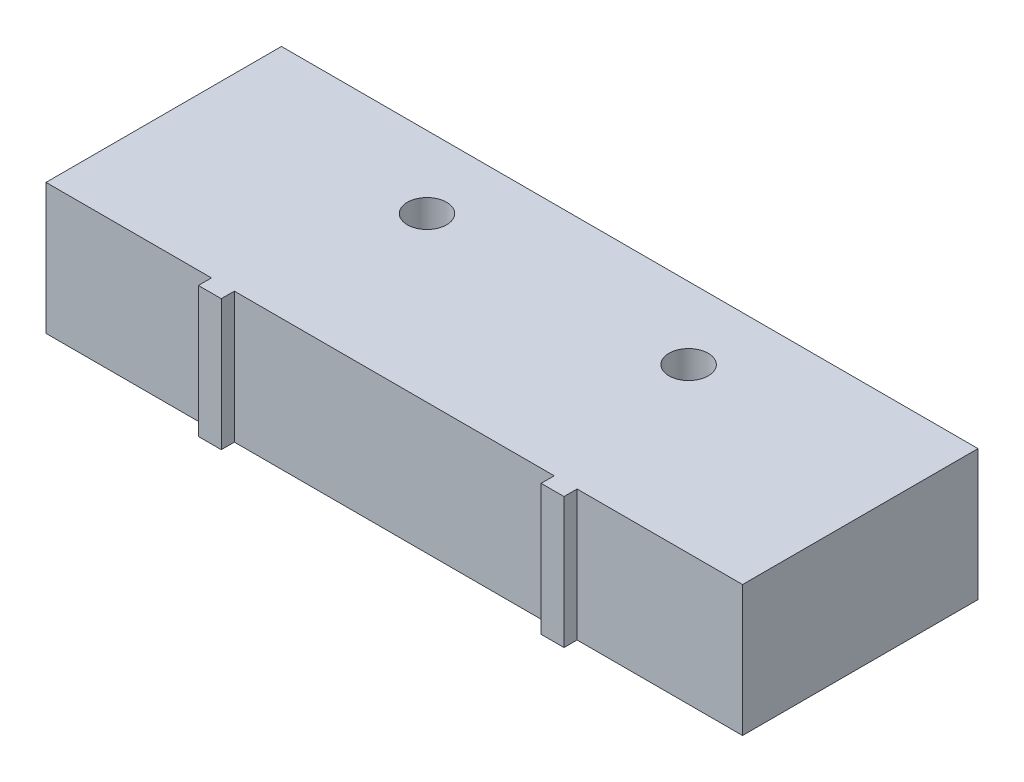
ISO-10303-21;
HEADER;
FILE_DESCRIPTION(('STEP AP214'),'2;1');
FILE_NAME('part.step','',(''),(''),'','','');
FILE_SCHEMA(('AUTOMOTIVE_DESIGN { 1 0 10303 214 1 1 1 1 }'));
ENDSEC;
DATA;
#1=APPLICATION_CONTEXT('core data for automotive mechanical design processes');
#2=APPLICATION_PROTOCOL_DEFINITION('international standard','automotive_design',2000,#1);
#3=PRODUCT_CONTEXT('',#1,'mechanical');
#4=PRODUCT('Part','Part','',(#3));
#5=PRODUCT_RELATED_PRODUCT_CATEGORY('part','',(#4));
#6=PRODUCT_DEFINITION_FORMATION('','',#4);
#7=PRODUCT_DEFINITION_CONTEXT('part definition',#1,'design');
#8=PRODUCT_DEFINITION('design','',#6,#7);
#9=PRODUCT_DEFINITION_SHAPE('','',#8);
#10=(LENGTH_UNIT() NAMED_UNIT(*) SI_UNIT(.MILLI.,.METRE.));
#11=(NAMED_UNIT(*) PLANE_ANGLE_UNIT() SI_UNIT($,.RADIAN.));
#12=(NAMED_UNIT(*) SI_UNIT($,.STERADIAN.) SOLID_ANGLE_UNIT());
#13=UNCERTAINTY_MEASURE_WITH_UNIT(LENGTH_MEASURE(1.E-05),#10,'distance_accuracy_value','');
#14=(GEOMETRIC_REPRESENTATION_CONTEXT(3) GLOBAL_UNCERTAINTY_ASSIGNED_CONTEXT((#13)) GLOBAL_UNIT_ASSIGNED_CONTEXT((#10,
#11,#12)) REPRESENTATION_CONTEXT('',''));
#15=CARTESIAN_POINT('',(0.,0.,0.));
#16=DIRECTION('',(0.,0.,1.));
#17=DIRECTION('',(1.,0.,0.));
#18=AXIS2_PLACEMENT_3D('',#15,#16,#17);
#19=CARTESIAN_POINT('',(0.,20.,0.));
#20=DIRECTION('',(0.,-1.,0.));
#21=DIRECTION('',(0.,0.,-1.));
#22=AXIS2_PLACEMENT_3D('',#19,#20,#21);
#23=PLANE('',#22);
#24=DIRECTION('',(0.,0.,1.));
#25=VECTOR('',#24,1.);
#26=CARTESIAN_POINT('',(0.,20.,0.));
#27=LINE('',#26,#25);
#28=CARTESIAN_POINT('',(0.,20.,-36.));
#29=VERTEX_POINT('',#28);
#30=CARTESIAN_POINT('',(0.,20.,0.));
#31=VERTEX_POINT('',#30);
#32=EDGE_CURVE('E206',#29,#31,#27,.T.);
#33=ORIENTED_EDGE('',*,*,#32,.T.);
#34=DIRECTION('',(1.,0.,0.));
#35=VECTOR('',#34,1.);
#36=CARTESIAN_POINT('',(0.,20.,0.));
#37=LINE('',#36,#35);
#38=CARTESIAN_POINT('',(25.3,20.,0.));
#39=VERTEX_POINT('',#38);
#40=EDGE_CURVE('E118',#31,#39,#37,.T.);
#41=ORIENTED_EDGE('',*,*,#40,.T.);
#42=DIRECTION('',(0.,0.,1.));
#43=VECTOR('',#42,1.);
#44=CARTESIAN_POINT('',(25.3,20.,0.));
#45=LINE('',#44,#43);
#46=CARTESIAN_POINT('',(25.3,20.,2.));
#47=VERTEX_POINT('',#46);
#48=EDGE_CURVE('E243',#39,#47,#45,.T.);
#49=ORIENTED_EDGE('',*,*,#48,.T.);
#50=DIRECTION('',(1.,0.,0.));
#51=VECTOR('',#50,1.);
#52=CARTESIAN_POINT('',(25.3,20.,2.));
#53=LINE('',#52,#51);
#54=CARTESIAN_POINT('',(28.8,20.,2.));
#55=VERTEX_POINT('',#54);
#56=EDGE_CURVE('E263',#47,#55,#53,.T.);
#57=ORIENTED_EDGE('',*,*,#56,.T.);
#58=DIRECTION('',(0.,0.,-1.));
#59=VECTOR('',#58,1.);
#60=CARTESIAN_POINT('',(28.8,20.,2.));
#61=LINE('',#60,#59);
#62=CARTESIAN_POINT('',(28.8,20.,0.));
#63=VERTEX_POINT('',#62);
#64=EDGE_CURVE('E259',#55,#63,#61,.T.);
#65=ORIENTED_EDGE('',*,*,#64,.T.);
#66=DIRECTION('',(1.,0.,0.));
#67=VECTOR('',#66,1.);
#68=CARTESIAN_POINT('',(28.8,20.,0.));
#69=LINE('',#68,#67);
#70=CARTESIAN_POINT('',(77.7,20.,0.));
#71=VERTEX_POINT('',#70);
#72=EDGE_CURVE('E262',#63,#71,#69,.T.);
#73=ORIENTED_EDGE('',*,*,#72,.T.);
#74=DIRECTION('',(0.,0.,1.));
#75=VECTOR('',#74,1.);
#76=CARTESIAN_POINT('',(77.7,20.,1.99999999999999));
#77=LINE('',#76,#75);
#78=CARTESIAN_POINT('',(77.7,20.,1.99999999999999));
#79=VERTEX_POINT('',#78);
#80=EDGE_CURVE('E267',#71,#79,#77,.T.);
#81=ORIENTED_EDGE('',*,*,#80,.T.);
#82=DIRECTION('',(1.,0.,0.));
#83=VECTOR('',#82,1.);
#84=CARTESIAN_POINT('',(81.2,20.,1.99999999999999));
#85=LINE('',#84,#83);
#86=CARTESIAN_POINT('',(81.2,20.,1.99999999999999));
#87=VERTEX_POINT('',#86);
#88=EDGE_CURVE('E274',#79,#87,#85,.T.);
#89=ORIENTED_EDGE('',*,*,#88,.T.);
#90=DIRECTION('',(0.,0.,-1.));
#91=VECTOR('',#90,1.);
#92=CARTESIAN_POINT('',(81.2,20.,0.));
#93=LINE('',#92,#91);
#94=CARTESIAN_POINT('',(81.2,20.,0.));
#95=VERTEX_POINT('',#94);
#96=EDGE_CURVE('E149',#87,#95,#93,.T.);
#97=ORIENTED_EDGE('',*,*,#96,.T.);
#98=DIRECTION('',(1.,0.,0.));
#99=VECTOR('',#98,1.);
#100=CARTESIAN_POINT('',(81.2,20.,0.));
#101=LINE('',#100,#99);
#102=CARTESIAN_POINT('',(106.5,20.,0.));
#103=VERTEX_POINT('',#102);
#104=EDGE_CURVE('E143',#95,#103,#101,.T.);
#105=ORIENTED_EDGE('',*,*,#104,.T.);
#106=DIRECTION('',(0.,0.,-1.));
#107=VECTOR('',#106,1.);
#108=CARTESIAN_POINT('',(106.5,20.,0.));
#109=LINE('',#108,#107);
#110=CARTESIAN_POINT('',(106.5,20.,-36.));
#111=VERTEX_POINT('',#110);
#112=EDGE_CURVE('E147',#103,#111,#109,.T.);
#113=ORIENTED_EDGE('',*,*,#112,.T.);
#114=DIRECTION('',(-1.,0.,0.));
#115=VECTOR('',#114,1.);
#116=CARTESIAN_POINT('',(0.,20.,-36.));
#117=LINE('',#116,#115);
#118=EDGE_CURVE('E63',#111,#29,#117,.T.);
#119=ORIENTED_EDGE('',*,*,#118,.T.);
#120=EDGE_LOOP('',(#33,#41,#49,#57,#65,#73,#81,#89,#97,#105,#113,#119));
#121=FACE_BOUND('',#120,.T.);
#122=CARTESIAN_POINT('',(33.25,20.,-25.));
#123=DIRECTION('',(0.,1.,0.));
#124=DIRECTION('',(0.,0.,1.));
#125=AXIS2_PLACEMENT_3D('',#122,#123,#124);
#126=CIRCLE('',#125,3.);
#127=CARTESIAN_POINT('',(33.25,20.,-22.));
#128=VERTEX_POINT('',#127);
#129=EDGE_CURVE('E176',#128,#128,#126,.T.);
#130=ORIENTED_EDGE('',*,*,#129,.F.);
#131=EDGE_LOOP('',(#130));
#132=FACE_BOUND('',#131,.T.);
#133=CARTESIAN_POINT('',(73.25,20.,-25.));
#134=DIRECTION('',(0.,1.,0.));
#135=DIRECTION('',(0.,0.,-1.));
#136=AXIS2_PLACEMENT_3D('',#133,#134,#135);
#137=CIRCLE('',#136,3.00000000000001);
#138=CARTESIAN_POINT('',(73.25,20.,-28.));
#139=VERTEX_POINT('',#138);
#140=EDGE_CURVE('E317',#139,#139,#137,.T.);
#141=ORIENTED_EDGE('',*,*,#140,.F.);
#142=EDGE_LOOP('',(#141));
#143=FACE_BOUND('',#142,.T.);
#144=ADVANCED_FACE('F45',(#121,#132,#143),#23,.F.);
#145=CARTESIAN_POINT('',(0.,0.,0.));
#146=DIRECTION('',(0.,-1.,0.));
#147=DIRECTION('',(0.,0.,-1.));
#148=AXIS2_PLACEMENT_3D('',#145,#146,#147);
#149=PLANE('',#148);
#150=CARTESIAN_POINT('',(33.25,0.,-25.));
#151=DIRECTION('',(0.,1.,0.));
#152=DIRECTION('',(0.,0.,1.));
#153=AXIS2_PLACEMENT_3D('',#150,#151,#152);
#154=CIRCLE('',#153,3.);
#155=CARTESIAN_POINT('',(33.25,0.,-22.));
#156=VERTEX_POINT('',#155);
#157=EDGE_CURVE('E324',#156,#156,#154,.T.);
#158=ORIENTED_EDGE('',*,*,#157,.T.);
#159=EDGE_LOOP('',(#158));
#160=FACE_BOUND('',#159,.T.);
#161=DIRECTION('',(0.,0.,1.));
#162=VECTOR('',#161,1.);
#163=CARTESIAN_POINT('',(0.,0.,0.));
#164=LINE('',#163,#162);
#165=CARTESIAN_POINT('',(0.,0.,-36.));
#166=VERTEX_POINT('',#165);
#167=CARTESIAN_POINT('',(0.,0.,0.));
#168=VERTEX_POINT('',#167);
#169=EDGE_CURVE('E171',#166,#168,#164,.T.);
#170=ORIENTED_EDGE('',*,*,#169,.F.);
#171=DIRECTION('',(-1.,0.,0.));
#172=VECTOR('',#171,1.);
#173=CARTESIAN_POINT('',(0.,0.,-36.));
#174=LINE('',#173,#172);
#175=CARTESIAN_POINT('',(106.5,0.,-36.));
#176=VERTEX_POINT('',#175);
#177=EDGE_CURVE('E110',#176,#166,#174,.T.);
#178=ORIENTED_EDGE('',*,*,#177,.F.);
#179=DIRECTION('',(0.,0.,-1.));
#180=VECTOR('',#179,1.);
#181=CARTESIAN_POINT('',(106.5,0.,0.));
#182=LINE('',#181,#180);
#183=CARTESIAN_POINT('',(106.5,0.,0.));
#184=VERTEX_POINT('',#183);
#185=EDGE_CURVE('E104',#184,#176,#182,.T.);
#186=ORIENTED_EDGE('',*,*,#185,.F.);
#187=DIRECTION('',(1.,0.,0.));
#188=VECTOR('',#187,1.);
#189=CARTESIAN_POINT('',(81.2,0.,0.));
#190=LINE('',#189,#188);
#191=CARTESIAN_POINT('',(81.2,0.,0.));
#192=VERTEX_POINT('',#191);
#193=EDGE_CURVE('E158',#192,#184,#190,.T.);
#194=ORIENTED_EDGE('',*,*,#193,.F.);
#195=DIRECTION('',(0.,0.,-1.));
#196=VECTOR('',#195,1.);
#197=CARTESIAN_POINT('',(81.2,0.,0.));
#198=LINE('',#197,#196);
#199=CARTESIAN_POINT('',(81.2,0.,1.99999999999999));
#200=VERTEX_POINT('',#199);
#201=EDGE_CURVE('E197',#200,#192,#198,.T.);
#202=ORIENTED_EDGE('',*,*,#201,.F.);
#203=DIRECTION('',(1.,0.,0.));
#204=VECTOR('',#203,1.);
#205=CARTESIAN_POINT('',(81.2,0.,1.99999999999999));
#206=LINE('',#205,#204);
#207=CARTESIAN_POINT('',(77.7,0.,1.99999999999999));
#208=VERTEX_POINT('',#207);
#209=EDGE_CURVE('E194',#208,#200,#206,.T.);
#210=ORIENTED_EDGE('',*,*,#209,.F.);
#211=DIRECTION('',(0.,0.,1.));
#212=VECTOR('',#211,1.);
#213=CARTESIAN_POINT('',(77.7,0.,1.99999999999999));
#214=LINE('',#213,#212);
#215=CARTESIAN_POINT('',(77.7,0.,0.));
#216=VERTEX_POINT('',#215);
#217=EDGE_CURVE('E191',#216,#208,#214,.T.);
#218=ORIENTED_EDGE('',*,*,#217,.F.);
#219=DIRECTION('',(1.,0.,0.));
#220=VECTOR('',#219,1.);
#221=CARTESIAN_POINT('',(28.8,0.,0.));
#222=LINE('',#221,#220);
#223=CARTESIAN_POINT('',(28.8,0.,0.));
#224=VERTEX_POINT('',#223);
#225=EDGE_CURVE('E188',#224,#216,#222,.T.);
#226=ORIENTED_EDGE('',*,*,#225,.F.);
#227=DIRECTION('',(0.,0.,-1.));
#228=VECTOR('',#227,1.);
#229=CARTESIAN_POINT('',(28.8,0.,2.));
#230=LINE('',#229,#228);
#231=CARTESIAN_POINT('',(28.8,0.,2.));
#232=VERTEX_POINT('',#231);
#233=EDGE_CURVE('E185',#232,#224,#230,.T.);
#234=ORIENTED_EDGE('',*,*,#233,.F.);
#235=DIRECTION('',(1.,0.,0.));
#236=VECTOR('',#235,1.);
#237=CARTESIAN_POINT('',(25.3,0.,2.));
#238=LINE('',#237,#236);
#239=CARTESIAN_POINT('',(25.3,0.,2.));
#240=VERTEX_POINT('',#239);
#241=EDGE_CURVE('E182',#240,#232,#238,.T.);
#242=ORIENTED_EDGE('',*,*,#241,.F.);
#243=DIRECTION('',(0.,0.,1.));
#244=VECTOR('',#243,1.);
#245=CARTESIAN_POINT('',(25.3,0.,0.));
#246=LINE('',#245,#244);
#247=CARTESIAN_POINT('',(25.3,0.,0.));
#248=VERTEX_POINT('',#247);
#249=EDGE_CURVE('E179',#248,#240,#246,.T.);
#250=ORIENTED_EDGE('',*,*,#249,.F.);
#251=DIRECTION('',(1.,0.,0.));
#252=VECTOR('',#251,1.);
#253=CARTESIAN_POINT('',(0.,0.,0.));
#254=LINE('',#253,#252);
#255=EDGE_CURVE('E175',#168,#248,#254,.T.);
#256=ORIENTED_EDGE('',*,*,#255,.F.);
#257=EDGE_LOOP('',(#170,#178,#186,#194,#202,#210,#218,#226,#234,#242,#250,#256));
#258=FACE_BOUND('',#257,.T.);
#259=CARTESIAN_POINT('',(73.25,0.,-25.));
#260=DIRECTION('',(0.,1.,0.));
#261=DIRECTION('',(0.,0.,-1.));
#262=AXIS2_PLACEMENT_3D('',#259,#260,#261);
#263=CIRCLE('',#262,3.00000000000001);
#264=CARTESIAN_POINT('',(73.25,0.,-28.));
#265=VERTEX_POINT('',#264);
#266=EDGE_CURVE('E320',#265,#265,#263,.T.);
#267=ORIENTED_EDGE('',*,*,#266,.T.);
#268=EDGE_LOOP('',(#267));
#269=FACE_BOUND('',#268,.T.);
#270=ADVANCED_FACE('F247',(#160,#258,#269),#149,.T.);
#271=CARTESIAN_POINT('',(0.,20.,0.));
#272=DIRECTION('',(1.,0.,0.));
#273=DIRECTION('',(0.,0.,-1.));
#274=AXIS2_PLACEMENT_3D('',#271,#272,#273);
#275=PLANE('',#274);
#276=ORIENTED_EDGE('',*,*,#169,.T.);
#277=DIRECTION('',(0.,-1.,0.));
#278=VECTOR('',#277,1.);
#279=CARTESIAN_POINT('',(0.,20.,0.));
#280=LINE('',#279,#278);
#281=EDGE_CURVE('E11',#31,#168,#280,.T.);
#282=ORIENTED_EDGE('',*,*,#281,.F.);
#283=ORIENTED_EDGE('',*,*,#32,.F.);
#284=DIRECTION('',(0.,-1.,0.));
#285=VECTOR('',#284,1.);
#286=CARTESIAN_POINT('',(0.,20.,-36.));
#287=LINE('',#286,#285);
#288=EDGE_CURVE('E167',#29,#166,#287,.T.);
#289=ORIENTED_EDGE('',*,*,#288,.T.);
#290=EDGE_LOOP('',(#276,#282,#283,#289));
#291=FACE_BOUND('',#290,.T.);
#292=ADVANCED_FACE('F47',(#291),#275,.F.);
#293=CARTESIAN_POINT('',(0.,20.,0.));
#294=DIRECTION('',(0.,0.,-1.));
#295=DIRECTION('',(-1.,0.,0.));
#296=AXIS2_PLACEMENT_3D('',#293,#294,#295);
#297=PLANE('',#296);
#298=ORIENTED_EDGE('',*,*,#255,.T.);
#299=DIRECTION('',(0.,-1.,0.));
#300=VECTOR('',#299,1.);
#301=CARTESIAN_POINT('',(25.3,20.,0.));
#302=LINE('',#301,#300);
#303=EDGE_CURVE('E55',#39,#248,#302,.T.);
#304=ORIENTED_EDGE('',*,*,#303,.F.);
#305=ORIENTED_EDGE('',*,*,#40,.F.);
#306=ORIENTED_EDGE('',*,*,#281,.T.);
#307=EDGE_LOOP('',(#298,#304,#305,#306));
#308=FACE_BOUND('',#307,.T.);
#309=ADVANCED_FACE('F426',(#308),#297,.F.);
#310=CARTESIAN_POINT('',(25.3,20.,0.));
#311=DIRECTION('',(1.,0.,0.));
#312=DIRECTION('',(0.,0.,-1.));
#313=AXIS2_PLACEMENT_3D('',#310,#311,#312);
#314=PLANE('',#313);
#315=ORIENTED_EDGE('',*,*,#249,.T.);
#316=DIRECTION('',(0.,-1.,0.));
#317=VECTOR('',#316,1.);
#318=CARTESIAN_POINT('',(25.3,20.,2.));
#319=LINE('',#318,#317);
#320=EDGE_CURVE('E233',#47,#240,#319,.T.);
#321=ORIENTED_EDGE('',*,*,#320,.F.);
#322=ORIENTED_EDGE('',*,*,#48,.F.);
#323=ORIENTED_EDGE('',*,*,#303,.T.);
#324=EDGE_LOOP('',(#315,#321,#322,#323));
#325=FACE_BOUND('',#324,.T.);
#326=ADVANCED_FACE('F241',(#325),#314,.F.);
#327=CARTESIAN_POINT('',(25.3,20.,2.));
#328=DIRECTION('',(0.,0.,-1.));
#329=DIRECTION('',(-1.,0.,0.));
#330=AXIS2_PLACEMENT_3D('',#327,#328,#329);
#331=PLANE('',#330);
#332=ORIENTED_EDGE('',*,*,#241,.T.);
#333=DIRECTION('',(0.,-1.,0.));
#334=VECTOR('',#333,1.);
#335=CARTESIAN_POINT('',(28.8,20.,2.));
#336=LINE('',#335,#334);
#337=EDGE_CURVE('E229',#55,#232,#336,.T.);
#338=ORIENTED_EDGE('',*,*,#337,.F.);
#339=ORIENTED_EDGE('',*,*,#56,.F.);
#340=ORIENTED_EDGE('',*,*,#320,.T.);
#341=EDGE_LOOP('',(#332,#338,#339,#340));
#342=FACE_BOUND('',#341,.T.);
#343=ADVANCED_FACE('F253',(#342),#331,.F.);
#344=CARTESIAN_POINT('',(28.8,20.,2.));
#345=DIRECTION('',(-1.,0.,0.));
#346=DIRECTION('',(0.,0.,1.));
#347=AXIS2_PLACEMENT_3D('',#344,#345,#346);
#348=PLANE('',#347);
#349=ORIENTED_EDGE('',*,*,#233,.T.);
#350=DIRECTION('',(0.,-1.,0.));
#351=VECTOR('',#350,1.);
#352=CARTESIAN_POINT('',(28.8,20.,0.));
#353=LINE('',#352,#351);
#354=EDGE_CURVE('E225',#63,#224,#353,.T.);
#355=ORIENTED_EDGE('',*,*,#354,.F.);
#356=ORIENTED_EDGE('',*,*,#64,.F.);
#357=ORIENTED_EDGE('',*,*,#337,.T.);
#358=EDGE_LOOP('',(#349,#355,#356,#357));
#359=FACE_BOUND('',#358,.T.);
#360=ADVANCED_FACE('F257',(#359),#348,.F.);
#361=CARTESIAN_POINT('',(28.8,20.,0.));
#362=DIRECTION('',(0.,0.,-1.));
#363=DIRECTION('',(-1.,0.,0.));
#364=AXIS2_PLACEMENT_3D('',#361,#362,#363);
#365=PLANE('',#364);
#366=ORIENTED_EDGE('',*,*,#225,.T.);
#367=DIRECTION('',(0.,-1.,0.));
#368=VECTOR('',#367,1.);
#369=CARTESIAN_POINT('',(77.7,20.,0.));
#370=LINE('',#369,#368);
#371=EDGE_CURVE('E221',#71,#216,#370,.T.);
#372=ORIENTED_EDGE('',*,*,#371,.F.);
#373=ORIENTED_EDGE('',*,*,#72,.F.);
#374=ORIENTED_EDGE('',*,*,#354,.T.);
#375=EDGE_LOOP('',(#366,#372,#373,#374));
#376=FACE_BOUND('',#375,.T.);
#377=ADVANCED_FACE('F391',(#376),#365,.F.);
#378=CARTESIAN_POINT('',(77.7,20.,1.99999999999999));
#379=DIRECTION('',(1.,0.,0.));
#380=DIRECTION('',(0.,0.,-1.));
#381=AXIS2_PLACEMENT_3D('',#378,#379,#380);
#382=PLANE('',#381);
#383=ORIENTED_EDGE('',*,*,#217,.T.);
#384=DIRECTION('',(0.,-1.,0.));
#385=VECTOR('',#384,1.);
#386=CARTESIAN_POINT('',(77.7,20.,1.99999999999999));
#387=LINE('',#386,#385);
#388=EDGE_CURVE('E217',#79,#208,#387,.T.);
#389=ORIENTED_EDGE('',*,*,#388,.F.);
#390=ORIENTED_EDGE('',*,*,#80,.F.);
#391=ORIENTED_EDGE('',*,*,#371,.T.);
#392=EDGE_LOOP('',(#383,#389,#390,#391));
#393=FACE_BOUND('',#392,.T.);
#394=ADVANCED_FACE('F382',(#393),#382,.F.);
#395=CARTESIAN_POINT('',(81.2,20.,1.99999999999999));
#396=DIRECTION('',(0.,0.,-1.));
#397=DIRECTION('',(-1.,0.,0.));
#398=AXIS2_PLACEMENT_3D('',#395,#396,#397);
#399=PLANE('',#398);
#400=ORIENTED_EDGE('',*,*,#209,.T.);
#401=DIRECTION('',(0.,-1.,0.));
#402=VECTOR('',#401,1.);
#403=CARTESIAN_POINT('',(81.2,20.,1.99999999999999));
#404=LINE('',#403,#402);
#405=EDGE_CURVE('E213',#87,#200,#404,.T.);
#406=ORIENTED_EDGE('',*,*,#405,.F.);
#407=ORIENTED_EDGE('',*,*,#88,.F.);
#408=ORIENTED_EDGE('',*,*,#388,.T.);
#409=EDGE_LOOP('',(#400,#406,#407,#408));
#410=FACE_BOUND('',#409,.T.);
#411=ADVANCED_FACE('F282',(#410),#399,.F.);
#412=CARTESIAN_POINT('',(81.2,20.,0.));
#413=DIRECTION('',(-1.,0.,0.));
#414=DIRECTION('',(0.,0.,1.));
#415=AXIS2_PLACEMENT_3D('',#412,#413,#414);
#416=PLANE('',#415);
#417=ORIENTED_EDGE('',*,*,#201,.T.);
#418=DIRECTION('',(0.,-1.,0.));
#419=VECTOR('',#418,1.);
#420=CARTESIAN_POINT('',(81.2,20.,0.));
#421=LINE('',#420,#419);
#422=EDGE_CURVE('E160',#95,#192,#421,.T.);
#423=ORIENTED_EDGE('',*,*,#422,.F.);
#424=ORIENTED_EDGE('',*,*,#96,.F.);
#425=ORIENTED_EDGE('',*,*,#405,.T.);
#426=EDGE_LOOP('',(#417,#423,#424,#425));
#427=FACE_BOUND('',#426,.T.);
#428=ADVANCED_FACE('F286',(#427),#416,.F.);
#429=CARTESIAN_POINT('',(81.2,20.,0.));
#430=DIRECTION('',(0.,0.,-1.));
#431=DIRECTION('',(-1.,0.,0.));
#432=AXIS2_PLACEMENT_3D('',#429,#430,#431);
#433=PLANE('',#432);
#434=ORIENTED_EDGE('',*,*,#193,.T.);
#435=DIRECTION('',(0.,-1.,0.));
#436=VECTOR('',#435,1.);
#437=CARTESIAN_POINT('',(106.5,20.,0.));
#438=LINE('',#437,#436);
#439=EDGE_CURVE('E155',#103,#184,#438,.T.);
#440=ORIENTED_EDGE('',*,*,#439,.F.);
#441=ORIENTED_EDGE('',*,*,#104,.F.);
#442=ORIENTED_EDGE('',*,*,#422,.T.);
#443=EDGE_LOOP('',(#434,#440,#441,#442));
#444=FACE_BOUND('',#443,.T.);
#445=ADVANCED_FACE('F156',(#444),#433,.F.);
#446=CARTESIAN_POINT('',(106.5,20.,0.));
#447=DIRECTION('',(-1.,0.,0.));
#448=DIRECTION('',(0.,0.,1.));
#449=AXIS2_PLACEMENT_3D('',#446,#447,#448);
#450=PLANE('',#449);
#451=ORIENTED_EDGE('',*,*,#185,.T.);
#452=DIRECTION('',(0.,-1.,0.));
#453=VECTOR('',#452,1.);
#454=CARTESIAN_POINT('',(106.5,20.,-36.));
#455=LINE('',#454,#453);
#456=EDGE_CURVE('E161',#111,#176,#455,.T.);
#457=ORIENTED_EDGE('',*,*,#456,.F.);
#458=ORIENTED_EDGE('',*,*,#112,.F.);
#459=ORIENTED_EDGE('',*,*,#439,.T.);
#460=EDGE_LOOP('',(#451,#457,#458,#459));
#461=FACE_BOUND('',#460,.T.);
#462=ADVANCED_FACE('F163',(#461),#450,.F.);
#463=CARTESIAN_POINT('',(0.,20.,-36.));
#464=DIRECTION('',(0.,0.,1.));
#465=DIRECTION('',(1.,0.,0.));
#466=AXIS2_PLACEMENT_3D('',#463,#464,#465);
#467=PLANE('',#466);
#468=ORIENTED_EDGE('',*,*,#177,.T.);
#469=ORIENTED_EDGE('',*,*,#288,.F.);
#470=ORIENTED_EDGE('',*,*,#118,.F.);
#471=ORIENTED_EDGE('',*,*,#456,.T.);
#472=EDGE_LOOP('',(#468,#469,#470,#471));
#473=FACE_BOUND('',#472,.T.);
#474=ADVANCED_FACE('F290',(#473),#467,.F.);
#475=CARTESIAN_POINT('',(33.25,20.,-25.));
#476=DIRECTION('',(0.,-1.,0.));
#477=DIRECTION('',(0.,0.,-1.));
#478=AXIS2_PLACEMENT_3D('',#475,#476,#477);
#479=CYLINDRICAL_SURFACE('',#478,3.);
#480=ORIENTED_EDGE('',*,*,#129,.T.);
#481=EDGE_LOOP('',(#480));
#482=FACE_BOUND('',#481,.T.);
#483=ORIENTED_EDGE('',*,*,#157,.F.);
#484=EDGE_LOOP('',(#483));
#485=FACE_BOUND('',#484,.T.);
#486=ADVANCED_FACE('F292',(#482,#485),#479,.F.);
#487=CARTESIAN_POINT('',(73.25,20.,-25.));
#488=DIRECTION('',(0.,-1.,0.));
#489=DIRECTION('',(0.,0.,-1.));
#490=AXIS2_PLACEMENT_3D('',#487,#488,#489);
#491=CYLINDRICAL_SURFACE('',#490,3.00000000000001);
#492=ORIENTED_EDGE('',*,*,#140,.T.);
#493=EDGE_LOOP('',(#492));
#494=FACE_BOUND('',#493,.T.);
#495=ORIENTED_EDGE('',*,*,#266,.F.);
#496=EDGE_LOOP('',(#495));
#497=FACE_BOUND('',#496,.T.);
#498=ADVANCED_FACE('F298',(#494,#497),#491,.F.);
#499=CLOSED_SHELL('',(#144,#270,#292,#309,#326,#343,#360,#377,#394,#411,#428,#445,#462,#474,
#486,#498));
#500=MANIFOLD_SOLID_BREP('B2',#499);
#501=ADVANCED_BREP_SHAPE_REPRESENTATION('',(#18,#500),#14);
#502=SHAPE_DEFINITION_REPRESENTATION(#9,#501);
ENDSEC;
END-ISO-10303-21;
